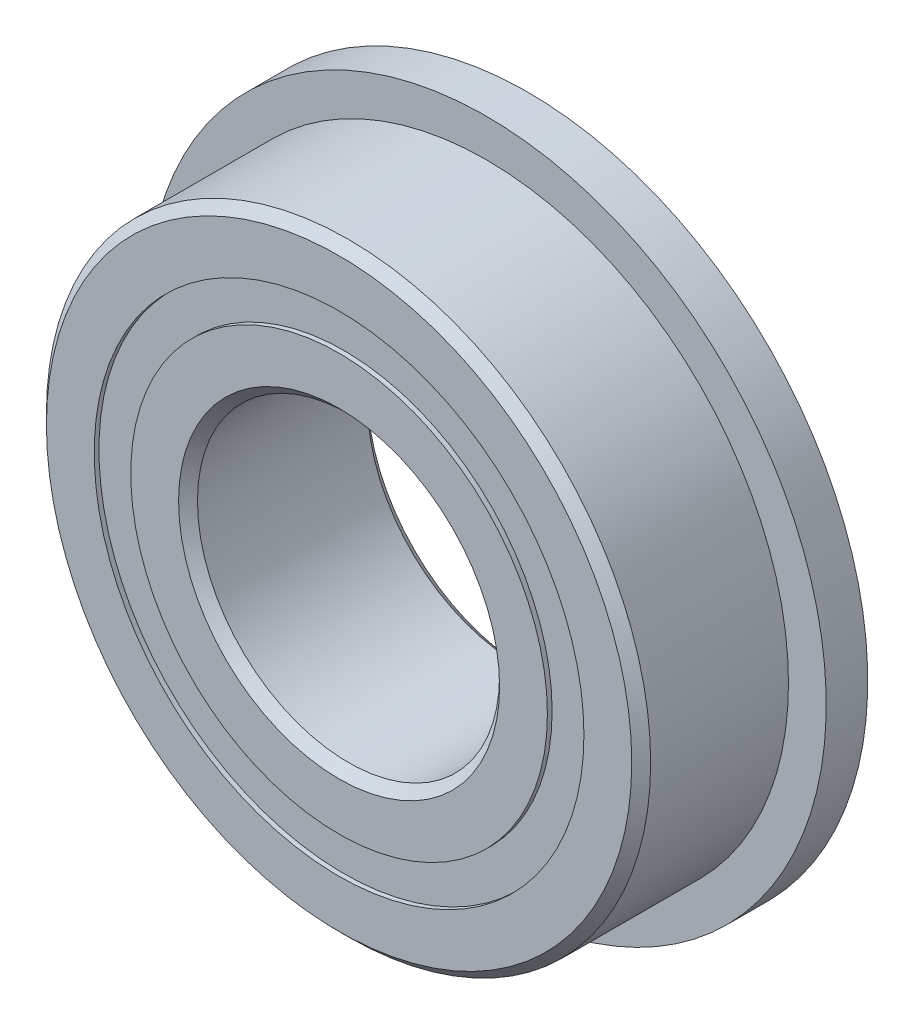
ISO-10303-21;
HEADER;
FILE_DESCRIPTION(('STEP AP214'),'2;1');
FILE_NAME('part.step','',(''),(''),'','','');
FILE_SCHEMA(('AUTOMOTIVE_DESIGN { 1 0 10303 214 1 1 1 1 }'));
ENDSEC;
DATA;
#1=APPLICATION_CONTEXT('core data for automotive mechanical design processes');
#2=APPLICATION_PROTOCOL_DEFINITION('international standard','automotive_design',2000,#1);
#3=PRODUCT_CONTEXT('',#1,'mechanical');
#4=PRODUCT('Part','Part','',(#3));
#5=PRODUCT_RELATED_PRODUCT_CATEGORY('part','',(#4));
#6=PRODUCT_DEFINITION_FORMATION('','',#4);
#7=PRODUCT_DEFINITION_CONTEXT('part definition',#1,'design');
#8=PRODUCT_DEFINITION('design','',#6,#7);
#9=PRODUCT_DEFINITION_SHAPE('','',#8);
#10=(LENGTH_UNIT() NAMED_UNIT(*) SI_UNIT(.MILLI.,.METRE.));
#11=(NAMED_UNIT(*) PLANE_ANGLE_UNIT() SI_UNIT($,.RADIAN.));
#12=(NAMED_UNIT(*) SI_UNIT($,.STERADIAN.) SOLID_ANGLE_UNIT());
#13=UNCERTAINTY_MEASURE_WITH_UNIT(LENGTH_MEASURE(1.E-05),#10,'distance_accuracy_value','');
#14=(GEOMETRIC_REPRESENTATION_CONTEXT(3) GLOBAL_UNCERTAINTY_ASSIGNED_CONTEXT((#13)) GLOBAL_UNIT_ASSIGNED_CONTEXT((#10,
#11,#12)) REPRESENTATION_CONTEXT('',''));
#15=CARTESIAN_POINT('',(0.,0.,0.));
#16=DIRECTION('',(0.,0.,1.));
#17=DIRECTION('',(1.,0.,0.));
#18=AXIS2_PLACEMENT_3D('',#15,#16,#17);
#19=CARTESIAN_POINT('',(0.,6.48351648351649,-2.375));
#20=DIRECTION('',(0.,0.,1.));
#21=DIRECTION('',(1.,0.,0.));
#22=AXIS2_PLACEMENT_3D('',#19,#20,#21);
#23=PLANE('',#22);
#24=CARTESIAN_POINT('',(0.,0.,-2.375));
#25=DIRECTION('',(0.,0.,1.));
#26=DIRECTION('',(1.,0.,0.));
#27=AXIS2_PLACEMENT_3D('',#24,#25,#26);
#28=CIRCLE('',#27,6.48351648351649);
#29=CARTESIAN_POINT('',(6.48351648351649,0.,-2.375));
#30=VERTEX_POINT('',#29);
#31=EDGE_CURVE('E59',#30,#30,#28,.T.);
#32=ORIENTED_EDGE('',*,*,#31,.F.);
#33=EDGE_LOOP('',(#32));
#34=FACE_BOUND('',#33,.T.);
#35=CARTESIAN_POINT('',(0.,0.,-2.375));
#36=DIRECTION('',(0.,0.,1.));
#37=DIRECTION('',(1.,0.,0.));
#38=AXIS2_PLACEMENT_3D('',#35,#36,#37);
#39=CIRCLE('',#38,5.51648351648352);
#40=CARTESIAN_POINT('',(5.51648351648352,0.,-2.375));
#41=VERTEX_POINT('',#40);
#42=EDGE_CURVE('E11',#41,#41,#39,.T.);
#43=ORIENTED_EDGE('',*,*,#42,.T.);
#44=EDGE_LOOP('',(#43));
#45=FACE_BOUND('',#44,.T.);
#46=ADVANCED_FACE('F45',(#34,#45),#23,.F.);
#47=CARTESIAN_POINT('',(0.,0.,2.5));
#48=DIRECTION('',(0.,0.,1.));
#49=DIRECTION('',(1.,0.,0.));
#50=AXIS2_PLACEMENT_3D('',#47,#48,#49);
#51=CYLINDRICAL_SURFACE('',#50,5.51648351648352);
#52=ORIENTED_EDGE('',*,*,#42,.F.);
#53=EDGE_LOOP('',(#52));
#54=FACE_BOUND('',#53,.T.);
#55=CARTESIAN_POINT('',(0.,0.,-1.21175743903915));
#56=DIRECTION('',(0.,0.,1.));
#57=DIRECTION('',(1.,0.,0.));
#58=AXIS2_PLACEMENT_3D('',#55,#56,#57);
#59=CIRCLE('',#58,5.51648351648352);
#60=CARTESIAN_POINT('',(5.51648351648352,0.,-1.21175743903915));
#61=VERTEX_POINT('',#60);
#62=EDGE_CURVE('E51',#61,#61,#59,.T.);
#63=ORIENTED_EDGE('',*,*,#62,.T.);
#64=EDGE_LOOP('',(#63));
#65=FACE_BOUND('',#64,.T.);
#66=ADVANCED_FACE('F68',(#54,#65),#51,.F.);
#67=CARTESIAN_POINT('',(0.,6.48351648351648,-1.21175743903915));
#68=DIRECTION('',(0.,0.,-1.));
#69=DIRECTION('',(-1.,0.,0.));
#70=AXIS2_PLACEMENT_3D('',#67,#68,#69);
#71=PLANE('',#70);
#72=ORIENTED_EDGE('',*,*,#62,.F.);
#73=EDGE_LOOP('',(#72));
#74=FACE_BOUND('',#73,.T.);
#75=CARTESIAN_POINT('',(0.,0.,-1.21175743903915));
#76=DIRECTION('',(0.,0.,1.));
#77=DIRECTION('',(1.,0.,0.));
#78=AXIS2_PLACEMENT_3D('',#75,#76,#77);
#79=CIRCLE('',#78,6.48351648351648);
#80=CARTESIAN_POINT('',(6.48351648351648,0.,-1.21175743903915));
#81=VERTEX_POINT('',#80);
#82=EDGE_CURVE('E55',#81,#81,#79,.T.);
#83=ORIENTED_EDGE('',*,*,#82,.T.);
#84=EDGE_LOOP('',(#83));
#85=FACE_BOUND('',#84,.T.);
#86=ADVANCED_FACE('F72',(#74,#85),#71,.F.);
#87=CARTESIAN_POINT('',(0.,0.,2.5));
#88=DIRECTION('',(0.,0.,1.));
#89=DIRECTION('',(1.,0.,0.));
#90=AXIS2_PLACEMENT_3D('',#87,#88,#89);
#91=CYLINDRICAL_SURFACE('',#90,6.48351648351649);
#92=ORIENTED_EDGE('',*,*,#82,.F.);
#93=EDGE_LOOP('',(#92));
#94=FACE_BOUND('',#93,.T.);
#95=ORIENTED_EDGE('',*,*,#31,.T.);
#96=EDGE_LOOP('',(#95));
#97=FACE_BOUND('',#96,.T.);
#98=ADVANCED_FACE('F65',(#94,#97),#91,.T.);
#99=CLOSED_SHELL('',(#46,#66,#86,#98));
#100=MANIFOLD_SOLID_BREP('B2',#99);
#101=CARTESIAN_POINT('',(0.,6.48351648351648,2.375));
#102=DIRECTION('',(0.,0.,-1.));
#103=DIRECTION('',(-1.,0.,0.));
#104=AXIS2_PLACEMENT_3D('',#101,#102,#103);
#105=PLANE('',#104);
#106=CARTESIAN_POINT('',(0.,0.,2.375));
#107=DIRECTION('',(0.,0.,1.));
#108=DIRECTION('',(1.,0.,0.));
#109=AXIS2_PLACEMENT_3D('',#106,#107,#108);
#110=CIRCLE('',#109,5.51648351648352);
#111=CARTESIAN_POINT('',(5.51648351648352,0.,2.375));
#112=VERTEX_POINT('',#111);
#113=EDGE_CURVE('E44',#112,#112,#110,.T.);
#114=ORIENTED_EDGE('',*,*,#113,.F.);
#115=EDGE_LOOP('',(#114));
#116=FACE_BOUND('',#115,.T.);
#117=CARTESIAN_POINT('',(0.,0.,2.375));
#118=DIRECTION('',(0.,0.,1.));
#119=DIRECTION('',(1.,0.,0.));
#120=AXIS2_PLACEMENT_3D('',#117,#118,#119);
#121=CIRCLE('',#120,6.48351648351648);
#122=CARTESIAN_POINT('',(6.48351648351648,0.,2.375));
#123=VERTEX_POINT('',#122);
#124=EDGE_CURVE('E126',#123,#123,#121,.T.);
#125=ORIENTED_EDGE('',*,*,#124,.T.);
#126=EDGE_LOOP('',(#125));
#127=FACE_BOUND('',#126,.T.);
#128=ADVANCED_FACE('F112',(#116,#127),#105,.F.);
#129=CARTESIAN_POINT('',(0.,0.,2.5));
#130=DIRECTION('',(0.,0.,1.));
#131=DIRECTION('',(1.,0.,0.));
#132=AXIS2_PLACEMENT_3D('',#129,#130,#131);
#133=CYLINDRICAL_SURFACE('',#132,5.51648351648352);
#134=CARTESIAN_POINT('',(0.,0.,1.21175743903915));
#135=DIRECTION('',(0.,0.,1.));
#136=DIRECTION('',(1.,0.,0.));
#137=AXIS2_PLACEMENT_3D('',#134,#135,#136);
#138=CIRCLE('',#137,5.51648351648352);
#139=CARTESIAN_POINT('',(5.51648351648352,0.,1.21175743903915));
#140=VERTEX_POINT('',#139);
#141=EDGE_CURVE('E118',#140,#140,#138,.T.);
#142=ORIENTED_EDGE('',*,*,#141,.F.);
#143=EDGE_LOOP('',(#142));
#144=FACE_BOUND('',#143,.T.);
#145=ORIENTED_EDGE('',*,*,#113,.T.);
#146=EDGE_LOOP('',(#145));
#147=FACE_BOUND('',#146,.T.);
#148=ADVANCED_FACE('F141',(#144,#147),#133,.F.);
#149=CARTESIAN_POINT('',(0.,6.48351648351648,1.21175743903915));
#150=DIRECTION('',(0.,0.,1.));
#151=DIRECTION('',(1.,0.,0.));
#152=AXIS2_PLACEMENT_3D('',#149,#150,#151);
#153=PLANE('',#152);
#154=CARTESIAN_POINT('',(0.,0.,1.21175743903915));
#155=DIRECTION('',(0.,0.,1.));
#156=DIRECTION('',(1.,0.,0.));
#157=AXIS2_PLACEMENT_3D('',#154,#155,#156);
#158=CIRCLE('',#157,6.48351648351648);
#159=CARTESIAN_POINT('',(6.48351648351648,0.,1.21175743903915));
#160=VERTEX_POINT('',#159);
#161=EDGE_CURVE('E122',#160,#160,#158,.T.);
#162=ORIENTED_EDGE('',*,*,#161,.F.);
#163=EDGE_LOOP('',(#162));
#164=FACE_BOUND('',#163,.T.);
#165=ORIENTED_EDGE('',*,*,#141,.T.);
#166=EDGE_LOOP('',(#165));
#167=FACE_BOUND('',#166,.T.);
#168=ADVANCED_FACE('F136',(#164,#167),#153,.F.);
#169=CARTESIAN_POINT('',(0.,0.,2.5));
#170=DIRECTION('',(0.,0.,1.));
#171=DIRECTION('',(1.,0.,0.));
#172=AXIS2_PLACEMENT_3D('',#169,#170,#171);
#173=CYLINDRICAL_SURFACE('',#172,6.48351648351648);
#174=ORIENTED_EDGE('',*,*,#124,.F.);
#175=EDGE_LOOP('',(#174));
#176=FACE_BOUND('',#175,.T.);
#177=ORIENTED_EDGE('',*,*,#161,.T.);
#178=EDGE_LOOP('',(#177));
#179=FACE_BOUND('',#178,.T.);
#180=ADVANCED_FACE('F133',(#176,#179),#173,.T.);
#181=CLOSED_SHELL('',(#128,#148,#168,#180));
#182=MANIFOLD_SOLID_BREP('B6',#181);
#183=CARTESIAN_POINT('',(-2.99999999999993,5.19615242270667,0.));
#184=DIRECTION('',(0.,0.,1.));
#185=DIRECTION('',(-0.499999999999989,0.866025403784445,0.));
#186=AXIS2_PLACEMENT_3D('',#183,#184,#185);
#187=SPHERICAL_SURFACE('',#186,1.21175743903915);
#188=CARTESIAN_POINT('',(-2.99999999999993,5.19615242270667,1.21175743903915));
#189=VERTEX_POINT('',#188);
#190=VERTEX_LOOP('',#189);
#191=FACE_BOUND('',#190,.T.);
#192=ADVANCED_FACE('F179',(#191),#187,.T.);
#193=CLOSED_SHELL('',(#192));
#194=MANIFOLD_SOLID_BREP('B39',#193);
#195=CARTESIAN_POINT('',(-5.1961524227066,3.00000000000006,0.));
#196=DIRECTION('',(0.,0.,1.));
#197=DIRECTION('',(-0.866025403784433,0.50000000000001,0.));
#198=AXIS2_PLACEMENT_3D('',#195,#196,#197);
#199=SPHERICAL_SURFACE('',#198,1.21175743903915);
#200=CARTESIAN_POINT('',(-5.1961524227066,3.00000000000006,1.21175743903915));
#201=VERTEX_POINT('',#200);
#202=VERTEX_LOOP('',#201);
#203=FACE_BOUND('',#202,.T.);
#204=ADVANCED_FACE('F199',(#203),#199,.T.);
#205=CLOSED_SHELL('',(#204));
#206=MANIFOLD_SOLID_BREP('B108',#205);
#207=CARTESIAN_POINT('',(-6.,0.,0.));
#208=DIRECTION('',(0.,0.,1.));
#209=DIRECTION('',(-1.,0.,0.));
#210=AXIS2_PLACEMENT_3D('',#207,#208,#209);
#211=SPHERICAL_SURFACE('',#210,1.21175743903915);
#212=CARTESIAN_POINT('',(-6.,0.,1.21175743903915));
#213=VERTEX_POINT('',#212);
#214=VERTEX_LOOP('',#213);
#215=FACE_BOUND('',#214,.T.);
#216=ADVANCED_FACE('F219',(#215),#211,.T.);
#217=CLOSED_SHELL('',(#216));
#218=MANIFOLD_SOLID_BREP('B175',#217);
#219=CARTESIAN_POINT('',(-5.19615242270666,-2.99999999999995,0.));
#220=DIRECTION('',(0.,0.,1.));
#221=DIRECTION('',(-0.866025403784443,-0.499999999999992,0.));
#222=AXIS2_PLACEMENT_3D('',#219,#220,#221);
#223=SPHERICAL_SURFACE('',#222,1.21175743903915);
#224=CARTESIAN_POINT('',(-5.19615242270666,-2.99999999999995,1.21175743903915));
#225=VERTEX_POINT('',#224);
#226=VERTEX_LOOP('',#225);
#227=FACE_BOUND('',#226,.T.);
#228=ADVANCED_FACE('F239',(#227),#223,.T.);
#229=CLOSED_SHELL('',(#228));
#230=MANIFOLD_SOLID_BREP('B195',#229);
#231=CARTESIAN_POINT('',(-3.00000000000004,-5.19615242270661,0.));
#232=DIRECTION('',(0.,0.,1.));
#233=DIRECTION('',(-0.500000000000007,-0.866025403784435,0.));
#234=AXIS2_PLACEMENT_3D('',#231,#232,#233);
#235=SPHERICAL_SURFACE('',#234,1.21175743903915);
#236=CARTESIAN_POINT('',(-3.00000000000004,-5.19615242270661,1.21175743903915));
#237=VERTEX_POINT('',#236);
#238=VERTEX_LOOP('',#237);
#239=FACE_BOUND('',#238,.T.);
#240=ADVANCED_FACE('F259',(#239),#235,.T.);
#241=CLOSED_SHELL('',(#240));
#242=MANIFOLD_SOLID_BREP('B215',#241);
#243=CARTESIAN_POINT('',(0.,-6.,0.));
#244=DIRECTION('',(0.,0.,1.));
#245=DIRECTION('',(0.,-1.,0.));
#246=AXIS2_PLACEMENT_3D('',#243,#244,#245);
#247=SPHERICAL_SURFACE('',#246,1.21175743903915);
#248=CARTESIAN_POINT('',(0.,-6.,1.21175743903915));
#249=VERTEX_POINT('',#248);
#250=VERTEX_LOOP('',#249);
#251=FACE_BOUND('',#250,.T.);
#252=ADVANCED_FACE('F279',(#251),#247,.T.);
#253=CLOSED_SHELL('',(#252));
#254=MANIFOLD_SOLID_BREP('B235',#253);
#255=CARTESIAN_POINT('',(2.99999999999997,-5.19615242270665,0.));
#256=DIRECTION('',(0.,0.,1.));
#257=DIRECTION('',(0.499999999999995,-0.866025403784442,0.));
#258=AXIS2_PLACEMENT_3D('',#255,#256,#257);
#259=SPHERICAL_SURFACE('',#258,1.21175743903915);
#260=CARTESIAN_POINT('',(2.99999999999997,-5.19615242270665,1.21175743903915));
#261=VERTEX_POINT('',#260);
#262=VERTEX_LOOP('',#261);
#263=FACE_BOUND('',#262,.T.);
#264=ADVANCED_FACE('F299',(#263),#259,.T.);
#265=CLOSED_SHELL('',(#264));
#266=MANIFOLD_SOLID_BREP('B255',#265);
#267=CARTESIAN_POINT('',(5.19615242270662,-3.00000000000002,0.));
#268=DIRECTION('',(0.,0.,1.));
#269=DIRECTION('',(0.866025403784436,-0.500000000000004,0.));
#270=AXIS2_PLACEMENT_3D('',#267,#268,#269);
#271=SPHERICAL_SURFACE('',#270,1.21175743903915);
#272=CARTESIAN_POINT('',(5.19615242270662,-3.00000000000002,1.21175743903915));
#273=VERTEX_POINT('',#272);
#274=VERTEX_LOOP('',#273);
#275=FACE_BOUND('',#274,.T.);
#276=ADVANCED_FACE('F319',(#275),#271,.T.);
#277=CLOSED_SHELL('',(#276));
#278=MANIFOLD_SOLID_BREP('B275',#277);
#279=CARTESIAN_POINT('',(6.,0.,0.));
#280=DIRECTION('',(0.,0.,1.));
#281=DIRECTION('',(1.,0.,0.));
#282=AXIS2_PLACEMENT_3D('',#279,#280,#281);
#283=SPHERICAL_SURFACE('',#282,1.21175743903915);
#284=CARTESIAN_POINT('',(6.,0.,1.21175743903915));
#285=VERTEX_POINT('',#284);
#286=VERTEX_LOOP('',#285);
#287=FACE_BOUND('',#286,.T.);
#288=ADVANCED_FACE('F339',(#287),#283,.T.);
#289=CLOSED_SHELL('',(#288));
#290=MANIFOLD_SOLID_BREP('B295',#289);
#291=CARTESIAN_POINT('',(5.19615242270664,2.99999999999999,0.));
#292=DIRECTION('',(0.,0.,1.));
#293=DIRECTION('',(0.86602540378444,0.499999999999998,0.));
#294=AXIS2_PLACEMENT_3D('',#291,#292,#293);
#295=SPHERICAL_SURFACE('',#294,1.21175743903915);
#296=CARTESIAN_POINT('',(5.19615242270664,2.99999999999999,1.21175743903915));
#297=VERTEX_POINT('',#296);
#298=VERTEX_LOOP('',#297);
#299=FACE_BOUND('',#298,.T.);
#300=ADVANCED_FACE('F359',(#299),#295,.T.);
#301=CLOSED_SHELL('',(#300));
#302=MANIFOLD_SOLID_BREP('B315',#301);
#303=CARTESIAN_POINT('',(3.00000000000001,5.19615242270663,0.));
#304=DIRECTION('',(0.,0.,1.));
#305=DIRECTION('',(0.500000000000001,0.866025403784438,0.));
#306=AXIS2_PLACEMENT_3D('',#303,#304,#305);
#307=SPHERICAL_SURFACE('',#306,1.21175743903915);
#308=CARTESIAN_POINT('',(3.00000000000001,5.19615242270663,1.21175743903915));
#309=VERTEX_POINT('',#308);
#310=VERTEX_LOOP('',#309);
#311=FACE_BOUND('',#310,.T.);
#312=ADVANCED_FACE('F379',(#311),#307,.T.);
#313=CLOSED_SHELL('',(#312));
#314=MANIFOLD_SOLID_BREP('B335',#313);
#315=CARTESIAN_POINT('',(0.,6.,0.));
#316=DIRECTION('',(0.,0.,1.));
#317=DIRECTION('',(0.,1.,0.));
#318=AXIS2_PLACEMENT_3D('',#315,#316,#317);
#319=SPHERICAL_SURFACE('',#318,1.21175743903915);
#320=CARTESIAN_POINT('',(0.,6.,1.21175743903915));
#321=VERTEX_POINT('',#320);
#322=VERTEX_LOOP('',#321);
#323=FACE_BOUND('',#322,.T.);
#324=ADVANCED_FACE('F401',(#323),#319,.T.);
#325=CLOSED_SHELL('',(#324));
#326=MANIFOLD_SOLID_BREP('B355',#325);
#327=CARTESIAN_POINT('',(0.,5.51648351648352,2.5));
#328=DIRECTION('',(0.,0.,-1.));
#329=DIRECTION('',(-1.,0.,0.));
#330=AXIS2_PLACEMENT_3D('',#327,#328,#329);
#331=PLANE('',#330);
#332=CARTESIAN_POINT('',(0.,0.,2.5));
#333=DIRECTION('',(0.,0.,1.));
#334=DIRECTION('',(1.,0.,0.));
#335=AXIS2_PLACEMENT_3D('',#332,#333,#334);
#336=CIRCLE('',#335,4.25);
#337=CARTESIAN_POINT('',(4.25,0.,2.5));
#338=VERTEX_POINT('',#337);
#339=EDGE_CURVE('E448',#338,#338,#336,.T.);
#340=ORIENTED_EDGE('',*,*,#339,.F.);
#341=EDGE_LOOP('',(#340));
#342=FACE_BOUND('',#341,.T.);
#343=CARTESIAN_POINT('',(0.,0.,2.5));
#344=DIRECTION('',(0.,0.,1.));
#345=DIRECTION('',(1.,0.,0.));
#346=AXIS2_PLACEMENT_3D('',#343,#344,#345);
#347=CIRCLE('',#346,5.51648351648352);
#348=CARTESIAN_POINT('',(5.51648351648352,0.,2.5));
#349=VERTEX_POINT('',#348);
#350=EDGE_CURVE('E400',#349,#349,#347,.T.);
#351=ORIENTED_EDGE('',*,*,#350,.T.);
#352=EDGE_LOOP('',(#351));
#353=FACE_BOUND('',#352,.T.);
#354=ADVANCED_FACE('F420',(#342,#353),#331,.F.);
#355=CARTESIAN_POINT('',(0.,0.,2.5));
#356=DIRECTION('',(0.,0.,1.));
#357=DIRECTION('',(1.,0.,0.));
#358=AXIS2_PLACEMENT_3D('',#355,#356,#357);
#359=CYLINDRICAL_SURFACE('',#358,5.51648351648352);
#360=ORIENTED_EDGE('',*,*,#350,.F.);
#361=EDGE_LOOP('',(#360));
#362=FACE_BOUND('',#361,.T.);
#363=CARTESIAN_POINT('',(0.,0.,1.11111111111111));
#364=DIRECTION('',(0.,0.,1.));
#365=DIRECTION('',(1.,0.,0.));
#366=AXIS2_PLACEMENT_3D('',#363,#364,#365);
#367=CIRCLE('',#366,5.51648351648352);
#368=CARTESIAN_POINT('',(5.51648351648352,0.,1.11111111111111));
#369=VERTEX_POINT('',#368);
#370=EDGE_CURVE('E426',#369,#369,#367,.T.);
#371=ORIENTED_EDGE('',*,*,#370,.T.);
#372=EDGE_LOOP('',(#371));
#373=FACE_BOUND('',#372,.T.);
#374=ADVANCED_FACE('F455',(#362,#373),#359,.T.);
#375=CARTESIAN_POINT('',(0.,0.,0.));
#376=DIRECTION('',(0.,0.,1.));
#377=DIRECTION('',(1.,0.,0.));
#378=AXIS2_PLACEMENT_3D('',#375,#376,#377);
#379=TOROIDAL_SURFACE('',#378,6.,1.21175743903915);
#380=ORIENTED_EDGE('',*,*,#370,.F.);
#381=EDGE_LOOP('',(#380));
#382=FACE_BOUND('',#381,.T.);
#383=CARTESIAN_POINT('',(0.,0.,-1.11111111111111));
#384=DIRECTION('',(0.,0.,1.));
#385=DIRECTION('',(1.,0.,0.));
#386=AXIS2_PLACEMENT_3D('',#383,#384,#385);
#387=CIRCLE('',#386,5.51648351648352);
#388=CARTESIAN_POINT('',(5.51648351648352,0.,-1.11111111111111));
#389=VERTEX_POINT('',#388);
#390=EDGE_CURVE('E430',#389,#389,#387,.T.);
#391=ORIENTED_EDGE('',*,*,#390,.T.);
#392=EDGE_LOOP('',(#391));
#393=FACE_BOUND('',#392,.T.);
#394=ADVANCED_FACE('F459',(#382,#393),#379,.F.);
#395=CARTESIAN_POINT('',(0.,0.,2.5));
#396=DIRECTION('',(0.,0.,1.));
#397=DIRECTION('',(1.,0.,0.));
#398=AXIS2_PLACEMENT_3D('',#395,#396,#397);
#399=CYLINDRICAL_SURFACE('',#398,5.51648351648352);
#400=ORIENTED_EDGE('',*,*,#390,.F.);
#401=EDGE_LOOP('',(#400));
#402=FACE_BOUND('',#401,.T.);
#403=CARTESIAN_POINT('',(0.,0.,-2.5));
#404=DIRECTION('',(0.,0.,1.));
#405=DIRECTION('',(1.,0.,0.));
#406=AXIS2_PLACEMENT_3D('',#403,#404,#405);
#407=CIRCLE('',#406,5.51648351648352);
#408=CARTESIAN_POINT('',(5.51648351648352,0.,-2.5));
#409=VERTEX_POINT('',#408);
#410=EDGE_CURVE('E434',#409,#409,#407,.T.);
#411=ORIENTED_EDGE('',*,*,#410,.T.);
#412=EDGE_LOOP('',(#411));
#413=FACE_BOUND('',#412,.T.);
#414=ADVANCED_FACE('F464',(#402,#413),#399,.T.);
#415=CARTESIAN_POINT('',(0.,4.25,-2.5));
#416=DIRECTION('',(0.,0.,1.));
#417=DIRECTION('',(1.,0.,0.));
#418=AXIS2_PLACEMENT_3D('',#415,#416,#417);
#419=PLANE('',#418);
#420=ORIENTED_EDGE('',*,*,#410,.F.);
#421=EDGE_LOOP('',(#420));
#422=FACE_BOUND('',#421,.T.);
#423=CARTESIAN_POINT('',(0.,0.,-2.5));
#424=DIRECTION('',(0.,0.,1.));
#425=DIRECTION('',(1.,0.,0.));
#426=AXIS2_PLACEMENT_3D('',#423,#424,#425);
#427=CIRCLE('',#426,4.25);
#428=CARTESIAN_POINT('',(4.25,0.,-2.5));
#429=VERTEX_POINT('',#428);
#430=EDGE_CURVE('E439',#429,#429,#427,.T.);
#431=ORIENTED_EDGE('',*,*,#430,.T.);
#432=EDGE_LOOP('',(#431));
#433=FACE_BOUND('',#432,.T.);
#434=ADVANCED_FACE('F470',(#422,#433),#419,.F.);
#435=CARTESIAN_POINT('',(0.,0.,-2.25));
#436=DIRECTION('',(0.,0.,-1.));
#437=DIRECTION('',(-1.,0.,0.));
#438=AXIS2_PLACEMENT_3D('',#435,#436,#437);
#439=CONICAL_SURFACE('',#438,4.,0.785398163397443);
#440=ORIENTED_EDGE('',*,*,#430,.F.);
#441=EDGE_LOOP('',(#440));
#442=FACE_BOUND('',#441,.T.);
#443=CARTESIAN_POINT('',(0.,0.,-2.25));
#444=DIRECTION('',(0.,0.,1.));
#445=DIRECTION('',(1.,0.,0.));
#446=AXIS2_PLACEMENT_3D('',#443,#444,#445);
#447=CIRCLE('',#446,4.);
#448=CARTESIAN_POINT('',(4.,0.,-2.25));
#449=VERTEX_POINT('',#448);
#450=EDGE_CURVE('E442',#449,#449,#447,.T.);
#451=ORIENTED_EDGE('',*,*,#450,.T.);
#452=EDGE_LOOP('',(#451));
#453=FACE_BOUND('',#452,.T.);
#454=ADVANCED_FACE('F474',(#442,#453),#439,.F.);
#455=CARTESIAN_POINT('',(0.,0.,2.5));
#456=DIRECTION('',(0.,0.,1.));
#457=DIRECTION('',(1.,0.,0.));
#458=AXIS2_PLACEMENT_3D('',#455,#456,#457);
#459=CYLINDRICAL_SURFACE('',#458,4.);
#460=ORIENTED_EDGE('',*,*,#450,.F.);
#461=EDGE_LOOP('',(#460));
#462=FACE_BOUND('',#461,.T.);
#463=CARTESIAN_POINT('',(0.,0.,2.25));
#464=DIRECTION('',(0.,0.,1.));
#465=DIRECTION('',(1.,0.,0.));
#466=AXIS2_PLACEMENT_3D('',#463,#464,#465);
#467=CIRCLE('',#466,4.);
#468=CARTESIAN_POINT('',(4.,0.,2.25));
#469=VERTEX_POINT('',#468);
#470=EDGE_CURVE('E445',#469,#469,#467,.T.);
#471=ORIENTED_EDGE('',*,*,#470,.T.);
#472=EDGE_LOOP('',(#471));
#473=FACE_BOUND('',#472,.T.);
#474=ADVANCED_FACE('F478',(#462,#473),#459,.F.);
#475=CARTESIAN_POINT('',(0.,0.,2.5));
#476=DIRECTION('',(0.,0.,1.));
#477=DIRECTION('',(1.,0.,0.));
#478=AXIS2_PLACEMENT_3D('',#475,#476,#477);
#479=CONICAL_SURFACE('',#478,4.25,0.785398163397453);
#480=ORIENTED_EDGE('',*,*,#470,.F.);
#481=EDGE_LOOP('',(#480));
#482=FACE_BOUND('',#481,.T.);
#483=ORIENTED_EDGE('',*,*,#339,.T.);
#484=EDGE_LOOP('',(#483));
#485=FACE_BOUND('',#484,.T.);
#486=ADVANCED_FACE('F452',(#482,#485),#479,.F.);
#487=CLOSED_SHELL('',(#354,#374,#394,#414,#434,#454,#474,#486));
#488=MANIFOLD_SOLID_BREP('B375',#487);
#489=CARTESIAN_POINT('',(0.,0.,2.25));
#490=DIRECTION('',(0.,0.,-1.));
#491=DIRECTION('',(-1.,0.,0.));
#492=AXIS2_PLACEMENT_3D('',#489,#490,#491);
#493=CONICAL_SURFACE('',#492,8.,0.785398163397446);
#494=CARTESIAN_POINT('',(0.,0.,2.5));
#495=DIRECTION('',(0.,0.,1.));
#496=DIRECTION('',(1.,0.,0.));
#497=AXIS2_PLACEMENT_3D('',#494,#495,#496);
#498=CIRCLE('',#497,7.75);
#499=CARTESIAN_POINT('',(7.75,0.,2.5));
#500=VERTEX_POINT('',#499);
#501=EDGE_CURVE('E563',#500,#500,#498,.T.);
#502=ORIENTED_EDGE('',*,*,#501,.F.);
#503=EDGE_LOOP('',(#502));
#504=FACE_BOUND('',#503,.T.);
#505=CARTESIAN_POINT('',(0.,0.,2.25));
#506=DIRECTION('',(0.,0.,1.));
#507=DIRECTION('',(1.,0.,0.));
#508=AXIS2_PLACEMENT_3D('',#505,#506,#507);
#509=CIRCLE('',#508,8.);
#510=CARTESIAN_POINT('',(8.,0.,2.25));
#511=VERTEX_POINT('',#510);
#512=EDGE_CURVE('E419',#511,#511,#509,.T.);
#513=ORIENTED_EDGE('',*,*,#512,.T.);
#514=EDGE_LOOP('',(#513));
#515=FACE_BOUND('',#514,.T.);
#516=ADVANCED_FACE('F541',(#504,#515),#493,.T.);
#517=CARTESIAN_POINT('',(0.,0.,2.5));
#518=DIRECTION('',(0.,0.,1.));
#519=DIRECTION('',(1.,0.,0.));
#520=AXIS2_PLACEMENT_3D('',#517,#518,#519);
#521=CYLINDRICAL_SURFACE('',#520,8.);
#522=CARTESIAN_POINT('',(0.,0.,-1.4));
#523=DIRECTION('',(0.,0.,1.));
#524=DIRECTION('',(1.,0.,0.));
#525=AXIS2_PLACEMENT_3D('',#522,#523,#524);
#526=CIRCLE('',#525,8.);
#527=CARTESIAN_POINT('',(8.,0.,-1.4));
#528=VERTEX_POINT('',#527);
#529=EDGE_CURVE('E566',#528,#528,#526,.T.);
#530=ORIENTED_EDGE('',*,*,#529,.T.);
#531=EDGE_LOOP('',(#530));
#532=FACE_BOUND('',#531,.T.);
#533=ORIENTED_EDGE('',*,*,#512,.F.);
#534=EDGE_LOOP('',(#533));
#535=FACE_BOUND('',#534,.T.);
#536=ADVANCED_FACE('F586',(#532,#535),#521,.T.);
#537=CARTESIAN_POINT('',(0.,7.75,-2.5));
#538=DIRECTION('',(0.,0.,1.));
#539=DIRECTION('',(1.,0.,0.));
#540=AXIS2_PLACEMENT_3D('',#537,#538,#539);
#541=PLANE('',#540);
#542=CARTESIAN_POINT('',(0.,0.,-2.5));
#543=DIRECTION('',(0.,0.,1.));
#544=DIRECTION('',(1.,0.,0.));
#545=AXIS2_PLACEMENT_3D('',#542,#543,#544);
#546=CIRCLE('',#545,6.48351648351648);
#547=CARTESIAN_POINT('',(6.48351648351648,0.,-2.5));
#548=VERTEX_POINT('',#547);
#549=EDGE_CURVE('E547',#548,#548,#546,.T.);
#550=ORIENTED_EDGE('',*,*,#549,.T.);
#551=EDGE_LOOP('',(#550));
#552=FACE_BOUND('',#551,.T.);
#553=CARTESIAN_POINT('',(0.,0.,-2.5));
#554=DIRECTION('',(0.,0.,-1.));
#555=DIRECTION('',(-1.,0.,0.));
#556=AXIS2_PLACEMENT_3D('',#553,#554,#555);
#557=CIRCLE('',#556,9.);
#558=CARTESIAN_POINT('',(-9.,0.,-2.5));
#559=VERTEX_POINT('',#558);
#560=EDGE_CURVE('E569',#559,#559,#557,.T.);
#561=ORIENTED_EDGE('',*,*,#560,.T.);
#562=EDGE_LOOP('',(#561));
#563=FACE_BOUND('',#562,.T.);
#564=ADVANCED_FACE('F589',(#552,#563),#541,.F.);
#565=CARTESIAN_POINT('',(0.,0.,2.5));
#566=DIRECTION('',(0.,0.,1.));
#567=DIRECTION('',(1.,0.,0.));
#568=AXIS2_PLACEMENT_3D('',#565,#566,#567);
#569=CYLINDRICAL_SURFACE('',#568,6.48351648351648);
#570=CARTESIAN_POINT('',(0.,0.,-1.11111111111111));
#571=DIRECTION('',(0.,0.,1.));
#572=DIRECTION('',(1.,0.,0.));
#573=AXIS2_PLACEMENT_3D('',#570,#571,#572);
#574=CIRCLE('',#573,6.48351648351648);
#575=CARTESIAN_POINT('',(6.48351648351648,0.,-1.11111111111111));
#576=VERTEX_POINT('',#575);
#577=EDGE_CURVE('E551',#576,#576,#574,.T.);
#578=ORIENTED_EDGE('',*,*,#577,.T.);
#579=EDGE_LOOP('',(#578));
#580=FACE_BOUND('',#579,.T.);
#581=ORIENTED_EDGE('',*,*,#549,.F.);
#582=EDGE_LOOP('',(#581));
#583=FACE_BOUND('',#582,.T.);
#584=ADVANCED_FACE('F594',(#580,#583),#569,.F.);
#585=CARTESIAN_POINT('',(0.,0.,0.));
#586=DIRECTION('',(0.,0.,1.));
#587=DIRECTION('',(1.,0.,0.));
#588=AXIS2_PLACEMENT_3D('',#585,#586,#587);
#589=TOROIDAL_SURFACE('',#588,6.,1.21175743903915);
#590=ORIENTED_EDGE('',*,*,#577,.F.);
#591=EDGE_LOOP('',(#590));
#592=FACE_BOUND('',#591,.T.);
#593=CARTESIAN_POINT('',(0.,0.,1.11111111111111));
#594=DIRECTION('',(0.,0.,1.));
#595=DIRECTION('',(1.,0.,0.));
#596=AXIS2_PLACEMENT_3D('',#593,#594,#595);
#597=CIRCLE('',#596,6.48351648351648);
#598=CARTESIAN_POINT('',(6.48351648351648,0.,1.11111111111111));
#599=VERTEX_POINT('',#598);
#600=EDGE_CURVE('E555',#599,#599,#597,.T.);
#601=ORIENTED_EDGE('',*,*,#600,.T.);
#602=EDGE_LOOP('',(#601));
#603=FACE_BOUND('',#602,.T.);
#604=ADVANCED_FACE('F600',(#592,#603),#589,.F.);
#605=CARTESIAN_POINT('',(0.,0.,2.5));
#606=DIRECTION('',(0.,0.,1.));
#607=DIRECTION('',(1.,0.,0.));
#608=AXIS2_PLACEMENT_3D('',#605,#606,#607);
#609=CYLINDRICAL_SURFACE('',#608,6.48351648351648);
#610=ORIENTED_EDGE('',*,*,#600,.F.);
#611=EDGE_LOOP('',(#610));
#612=FACE_BOUND('',#611,.T.);
#613=CARTESIAN_POINT('',(0.,0.,2.5));
#614=DIRECTION('',(0.,0.,1.));
#615=DIRECTION('',(1.,0.,0.));
#616=AXIS2_PLACEMENT_3D('',#613,#614,#615);
#617=CIRCLE('',#616,6.48351648351648);
#618=CARTESIAN_POINT('',(6.48351648351648,0.,2.5));
#619=VERTEX_POINT('',#618);
#620=EDGE_CURVE('E560',#619,#619,#617,.T.);
#621=ORIENTED_EDGE('',*,*,#620,.T.);
#622=EDGE_LOOP('',(#621));
#623=FACE_BOUND('',#622,.T.);
#624=ADVANCED_FACE('F604',(#612,#623),#609,.F.);
#625=CARTESIAN_POINT('',(0.,7.75,2.5));
#626=DIRECTION('',(0.,0.,-1.));
#627=DIRECTION('',(-1.,0.,0.));
#628=AXIS2_PLACEMENT_3D('',#625,#626,#627);
#629=PLANE('',#628);
#630=ORIENTED_EDGE('',*,*,#620,.F.);
#631=EDGE_LOOP('',(#630));
#632=FACE_BOUND('',#631,.T.);
#633=ORIENTED_EDGE('',*,*,#501,.T.);
#634=EDGE_LOOP('',(#633));
#635=FACE_BOUND('',#634,.T.);
#636=ADVANCED_FACE('F582',(#632,#635),#629,.F.);
#637=CARTESIAN_POINT('',(0.,6.48351648351648,-1.4));
#638=DIRECTION('',(0.,0.,1.));
#639=DIRECTION('',(1.,0.,0.));
#640=AXIS2_PLACEMENT_3D('',#637,#638,#639);
#641=PLANE('',#640);
#642=CARTESIAN_POINT('',(0.,0.,-1.4));
#643=DIRECTION('',(0.,0.,-1.));
#644=DIRECTION('',(-1.,0.,0.));
#645=AXIS2_PLACEMENT_3D('',#642,#643,#644);
#646=CIRCLE('',#645,9.);
#647=CARTESIAN_POINT('',(-9.,0.,-1.4));
#648=VERTEX_POINT('',#647);
#649=EDGE_CURVE('E572',#648,#648,#646,.T.);
#650=ORIENTED_EDGE('',*,*,#649,.F.);
#651=EDGE_LOOP('',(#650));
#652=FACE_BOUND('',#651,.T.);
#653=ORIENTED_EDGE('',*,*,#529,.F.);
#654=EDGE_LOOP('',(#653));
#655=FACE_BOUND('',#654,.T.);
#656=ADVANCED_FACE('F579',(#652,#655),#641,.T.);
#657=CARTESIAN_POINT('',(0.,0.,-2.5));
#658=DIRECTION('',(0.,0.,-1.));
#659=DIRECTION('',(-1.,0.,0.));
#660=AXIS2_PLACEMENT_3D('',#657,#658,#659);
#661=CYLINDRICAL_SURFACE('',#660,9.);
#662=ORIENTED_EDGE('',*,*,#649,.T.);
#663=EDGE_LOOP('',(#662));
#664=FACE_BOUND('',#663,.T.);
#665=ORIENTED_EDGE('',*,*,#560,.F.);
#666=EDGE_LOOP('',(#665));
#667=FACE_BOUND('',#666,.T.);
#668=ADVANCED_FACE('F576',(#664,#667),#661,.T.);
#669=CLOSED_SHELL('',(#516,#536,#564,#584,#604,#624,#636,#656,#668));
#670=MANIFOLD_SOLID_BREP('B395',#669);
#671=ADVANCED_BREP_SHAPE_REPRESENTATION('',(#18,#100,#182,#194,#206,#218,#230,#242,#254,#266,
#278,#290,#302,#314,#326,#488,#670),#14);
#672=SHAPE_DEFINITION_REPRESENTATION(#9,#671);
ENDSEC;
END-ISO-10303-21;
